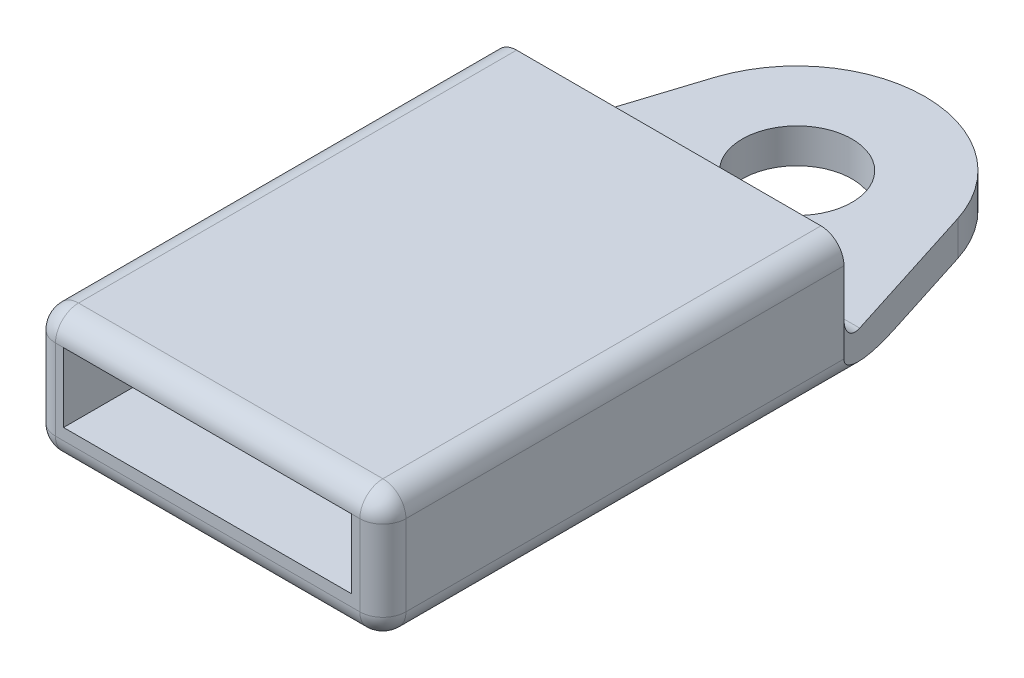
ISO-10303-21;
HEADER;
FILE_DESCRIPTION(('STEP AP214'),'2;1');
FILE_NAME('part.step','',(''),(''),'','','');
FILE_SCHEMA(('AUTOMOTIVE_DESIGN { 1 0 10303 214 1 1 1 1 }'));
ENDSEC;
DATA;
#1=APPLICATION_CONTEXT('core data for automotive mechanical design processes');
#2=APPLICATION_PROTOCOL_DEFINITION('international standard','automotive_design',2000,#1);
#3=PRODUCT_CONTEXT('',#1,'mechanical');
#4=PRODUCT('Part','Part','',(#3));
#5=PRODUCT_RELATED_PRODUCT_CATEGORY('part','',(#4));
#6=PRODUCT_DEFINITION_FORMATION('','',#4);
#7=PRODUCT_DEFINITION_CONTEXT('part definition',#1,'design');
#8=PRODUCT_DEFINITION('design','',#6,#7);
#9=PRODUCT_DEFINITION_SHAPE('','',#8);
#10=(LENGTH_UNIT() NAMED_UNIT(*) SI_UNIT(.MILLI.,.METRE.));
#11=(NAMED_UNIT(*) PLANE_ANGLE_UNIT() SI_UNIT($,.RADIAN.));
#12=(NAMED_UNIT(*) SI_UNIT($,.STERADIAN.) SOLID_ANGLE_UNIT());
#13=UNCERTAINTY_MEASURE_WITH_UNIT(LENGTH_MEASURE(1.E-05),#10,'distance_accuracy_value','');
#14=(GEOMETRIC_REPRESENTATION_CONTEXT(3) GLOBAL_UNCERTAINTY_ASSIGNED_CONTEXT((#13)) GLOBAL_UNIT_ASSIGNED_CONTEXT((#10,
#11,#12)) REPRESENTATION_CONTEXT('',''));
#15=CARTESIAN_POINT('',(0.,0.,0.));
#16=DIRECTION('',(0.,0.,1.));
#17=DIRECTION('',(1.,0.,0.));
#18=AXIS2_PLACEMENT_3D('',#15,#16,#17);
#19=CARTESIAN_POINT('',(0.,11.,-40.));
#20=DIRECTION('',(0.,0.,1.));
#21=DIRECTION('',(1.,0.,0.));
#22=AXIS2_PLACEMENT_3D('',#19,#20,#21);
#23=PLANE('',#22);
#24=DIRECTION('',(0.,-1.,0.));
#25=VECTOR('',#24,1.);
#26=CARTESIAN_POINT('',(0.,11.,-40.));
#27=LINE('',#26,#25);
#28=CARTESIAN_POINT('',(0.,9.,-40.));
#29=VERTEX_POINT('',#28);
#30=CARTESIAN_POINT('',(0.,5.,-40.));
#31=VERTEX_POINT('',#30);
#32=EDGE_CURVE('E308',#29,#31,#27,.T.);
#33=ORIENTED_EDGE('',*,*,#32,.T.);
#34=DIRECTION('',(1.,0.,0.));
#35=VECTOR('',#34,1.);
#36=CARTESIAN_POINT('',(0.,5.,-40.));
#37=LINE('',#36,#35);
#38=CARTESIAN_POINT('',(-2.7,5.,-40.));
#39=VERTEX_POINT('',#38);
#40=EDGE_CURVE('E256',#31,#39,#37,.F.);
#41=ORIENTED_EDGE('',*,*,#40,.T.);
#42=DIRECTION('',(0.,-1.,0.));
#43=VECTOR('',#42,1.);
#44=CARTESIAN_POINT('',(-2.7,11.,-40.));
#45=LINE('',#44,#43);
#46=CARTESIAN_POINT('',(-2.70000000000437,9.00000000000001,-40.));
#47=VERTEX_POINT('',#46);
#48=EDGE_CURVE('E282',#47,#39,#45,.T.);
#49=ORIENTED_EDGE('',*,*,#48,.F.);
#50=DIRECTION('',(-1.,0.,0.));
#51=VECTOR('',#50,1.);
#52=CARTESIAN_POINT('',(500000.,9.00000000000001,-40.0000000001301));
#53=LINE('',#52,#51);
#54=CARTESIAN_POINT('',(-27.7,9.00000000000001,-40.));
#55=VERTEX_POINT('',#54);
#56=EDGE_CURVE('E276',#47,#55,#53,.T.);
#57=ORIENTED_EDGE('',*,*,#56,.T.);
#58=DIRECTION('',(0.,-1.,0.));
#59=VECTOR('',#58,1.);
#60=CARTESIAN_POINT('',(-27.7,11.,-40.));
#61=LINE('',#60,#59);
#62=CARTESIAN_POINT('',(-27.7,5.,-40.));
#63=VERTEX_POINT('',#62);
#64=EDGE_CURVE('E234',#55,#63,#61,.T.);
#65=ORIENTED_EDGE('',*,*,#64,.T.);
#66=DIRECTION('',(1.,0.,0.));
#67=VECTOR('',#66,1.);
#68=CARTESIAN_POINT('',(0.,5.,-40.));
#69=LINE('',#68,#67);
#70=CARTESIAN_POINT('',(-30.4,5.,-40.));
#71=VERTEX_POINT('',#70);
#72=EDGE_CURVE('E253',#63,#71,#69,.F.);
#73=ORIENTED_EDGE('',*,*,#72,.T.);
#74=DIRECTION('',(0.,-1.,0.));
#75=VECTOR('',#74,1.);
#76=CARTESIAN_POINT('',(-30.4,11.,-40.));
#77=LINE('',#76,#75);
#78=CARTESIAN_POINT('',(-30.4,9.,-40.));
#79=VERTEX_POINT('',#78);
#80=EDGE_CURVE('E278',#79,#71,#77,.T.);
#81=ORIENTED_EDGE('',*,*,#80,.F.);
#82=CARTESIAN_POINT('',(-28.4,9.,-40.));
#83=DIRECTION('',(0.,0.,1.));
#84=DIRECTION('',(1.,0.,0.));
#85=AXIS2_PLACEMENT_3D('',#82,#83,#84);
#86=CIRCLE('',#85,2.);
#87=CARTESIAN_POINT('',(-28.4,11.,-40.));
#88=VERTEX_POINT('',#87);
#89=EDGE_CURVE('E343',#79,#88,#86,.F.);
#90=ORIENTED_EDGE('',*,*,#89,.T.);
#91=DIRECTION('',(-1.,0.,0.));
#92=VECTOR('',#91,1.);
#93=CARTESIAN_POINT('',(0.,11.,-40.));
#94=LINE('',#93,#92);
#95=CARTESIAN_POINT('',(-2.,11.,-40.));
#96=VERTEX_POINT('',#95);
#97=EDGE_CURVE('E301',#96,#88,#94,.T.);
#98=ORIENTED_EDGE('',*,*,#97,.F.);
#99=CARTESIAN_POINT('',(-2.,9.,-40.));
#100=DIRECTION('',(0.,0.,1.));
#101=DIRECTION('',(1.,0.,0.));
#102=AXIS2_PLACEMENT_3D('',#99,#100,#101);
#103=CIRCLE('',#102,2.);
#104=EDGE_CURVE('E344',#96,#29,#103,.F.);
#105=ORIENTED_EDGE('',*,*,#104,.T.);
#106=EDGE_LOOP('',(#33,#41,#49,#57,#65,#73,#81,#90,#98,#105));
#107=FACE_BOUND('',#106,.T.);
#108=ADVANCED_FACE('F34',(#107),#23,.F.);
#109=CARTESIAN_POINT('',(-27.7,11.,0.));
#110=DIRECTION('',(1.,0.,0.));
#111=DIRECTION('',(0.,0.,-1.));
#112=AXIS2_PLACEMENT_3D('',#109,#110,#111);
#113=PLANE('',#112);
#114=ORIENTED_EDGE('',*,*,#64,.F.);
#115=DIRECTION('',(0.,0.,-1.));
#116=VECTOR('',#115,1.);
#117=CARTESIAN_POINT('',(-27.7,9.00000000000001,-40.));
#118=LINE('',#117,#116);
#119=CARTESIAN_POINT('',(-27.7,9.,0.));
#120=VERTEX_POINT('',#119);
#121=EDGE_CURVE('E318',#120,#55,#118,.T.);
#122=ORIENTED_EDGE('',*,*,#121,.F.);
#123=DIRECTION('',(0.,-1.,0.));
#124=VECTOR('',#123,1.);
#125=CARTESIAN_POINT('',(-27.7,11.,0.));
#126=LINE('',#125,#124);
#127=CARTESIAN_POINT('',(-27.7,3.,0.));
#128=VERTEX_POINT('',#127);
#129=EDGE_CURVE('E304',#120,#128,#126,.T.);
#130=ORIENTED_EDGE('',*,*,#129,.T.);
#131=DIRECTION('',(0.,0.,1.));
#132=VECTOR('',#131,1.);
#133=CARTESIAN_POINT('',(-27.7,3.,-40.));
#134=LINE('',#133,#132);
#135=CARTESIAN_POINT('',(-27.7,3.,-42.));
#136=VERTEX_POINT('',#135);
#137=EDGE_CURVE('E269',#136,#128,#134,.T.);
#138=ORIENTED_EDGE('',*,*,#137,.F.);
#139=CARTESIAN_POINT('',(-27.7,5.,-42.));
#140=DIRECTION('',(1.,0.,0.));
#141=DIRECTION('',(0.,0.,-1.));
#142=AXIS2_PLACEMENT_3D('',#139,#140,#141);
#143=CIRCLE('',#142,2.);
#144=EDGE_CURVE('E43',#136,#63,#143,.F.);
#145=ORIENTED_EDGE('',*,*,#144,.T.);
#146=EDGE_LOOP('',(#114,#122,#130,#138,#145));
#147=FACE_BOUND('',#146,.T.);
#148=ADVANCED_FACE('F266',(#147),#113,.T.);
#149=CARTESIAN_POINT('',(-2.7,11.,0.));
#150=DIRECTION('',(1.,0.,0.));
#151=DIRECTION('',(0.,0.,-1.));
#152=AXIS2_PLACEMENT_3D('',#149,#150,#151);
#153=PLANE('',#152);
#154=DIRECTION('',(0.,0.,-1.));
#155=VECTOR('',#154,1.);
#156=CARTESIAN_POINT('',(-2.70000000000437,9.00000000000001,-40.0000000000976));
#157=LINE('',#156,#155);
#158=CARTESIAN_POINT('',(-2.70000000000437,9.,0.));
#159=VERTEX_POINT('',#158);
#160=EDGE_CURVE('E313',#159,#47,#157,.T.);
#161=ORIENTED_EDGE('',*,*,#160,.T.);
#162=ORIENTED_EDGE('',*,*,#48,.T.);
#163=CARTESIAN_POINT('',(-2.7,5.,-42.));
#164=DIRECTION('',(1.,0.,0.));
#165=DIRECTION('',(0.,0.,-1.));
#166=AXIS2_PLACEMENT_3D('',#163,#164,#165);
#167=CIRCLE('',#166,2.);
#168=CARTESIAN_POINT('',(-2.7,3.,-42.));
#169=VERTEX_POINT('',#168);
#170=EDGE_CURVE('E261',#39,#169,#167,.T.);
#171=ORIENTED_EDGE('',*,*,#170,.T.);
#172=DIRECTION('',(0.,0.,-1.));
#173=VECTOR('',#172,1.);
#174=CARTESIAN_POINT('',(-2.7,3.,-40.));
#175=LINE('',#174,#173);
#176=CARTESIAN_POINT('',(-2.7,3.,0.));
#177=VERTEX_POINT('',#176);
#178=EDGE_CURVE('E284',#177,#169,#175,.T.);
#179=ORIENTED_EDGE('',*,*,#178,.F.);
#180=DIRECTION('',(0.,-1.,0.));
#181=VECTOR('',#180,1.);
#182=CARTESIAN_POINT('',(-2.7,11.,0.));
#183=LINE('',#182,#181);
#184=EDGE_CURVE('E287',#159,#177,#183,.T.);
#185=ORIENTED_EDGE('',*,*,#184,.F.);
#186=EDGE_LOOP('',(#161,#162,#171,#179,#185));
#187=FACE_BOUND('',#186,.T.);
#188=ADVANCED_FACE('F409',(#187),#153,.F.);
#189=CARTESIAN_POINT('',(-30.4,11.,0.));
#190=DIRECTION('',(-1.,0.,0.));
#191=DIRECTION('',(0.,0.,1.));
#192=AXIS2_PLACEMENT_3D('',#189,#190,#191);
#193=PLANE('',#192);
#194=DIRECTION('',(0.,-1.,0.));
#195=VECTOR('',#194,1.);
#196=CARTESIAN_POINT('',(-30.4,100.652782585308,-40.));
#197=LINE('',#196,#195);
#198=CARTESIAN_POINT('',(-30.4,2.,-40.));
#199=VERTEX_POINT('',#198);
#200=EDGE_CURVE('E181',#71,#199,#197,.T.);
#201=ORIENTED_EDGE('',*,*,#200,.T.);
#202=DIRECTION('',(0.,0.,-1.));
#203=VECTOR('',#202,1.);
#204=CARTESIAN_POINT('',(-30.4,2.,-2.));
#205=LINE('',#204,#203);
#206=CARTESIAN_POINT('',(-30.4,2.,-2.));
#207=VERTEX_POINT('',#206);
#208=EDGE_CURVE('E251',#199,#207,#205,.F.);
#209=ORIENTED_EDGE('',*,*,#208,.T.);
#210=DIRECTION('',(0.,-1.,0.));
#211=VECTOR('',#210,1.);
#212=CARTESIAN_POINT('',(-30.4,11.,-2.));
#213=LINE('',#212,#211);
#214=CARTESIAN_POINT('',(-30.4,9.,-2.));
#215=VERTEX_POINT('',#214);
#216=EDGE_CURVE('E337',#207,#215,#213,.F.);
#217=ORIENTED_EDGE('',*,*,#216,.T.);
#218=DIRECTION('',(0.,0.,-1.));
#219=VECTOR('',#218,1.);
#220=CARTESIAN_POINT('',(-30.4,9.,0.));
#221=LINE('',#220,#219);
#222=EDGE_CURVE('E334',#215,#79,#221,.T.);
#223=ORIENTED_EDGE('',*,*,#222,.T.);
#224=ORIENTED_EDGE('',*,*,#80,.T.);
#225=EDGE_LOOP('',(#201,#209,#217,#223,#224));
#226=FACE_BOUND('',#225,.T.);
#227=ADVANCED_FACE('F458',(#226),#193,.T.);
#228=CARTESIAN_POINT('',(0.,11.,0.));
#229=DIRECTION('',(0.,0.,1.));
#230=DIRECTION('',(1.,0.,0.));
#231=AXIS2_PLACEMENT_3D('',#228,#229,#230);
#232=PLANE('',#231);
#233=DIRECTION('',(0.,-1.,0.));
#234=VECTOR('',#233,1.);
#235=CARTESIAN_POINT('',(-28.4,11.,0.));
#236=LINE('',#235,#234);
#237=CARTESIAN_POINT('',(-28.4,9.,0.));
#238=VERTEX_POINT('',#237);
#239=CARTESIAN_POINT('',(-28.4,2.,0.));
#240=VERTEX_POINT('',#239);
#241=EDGE_CURVE('E325',#238,#240,#236,.T.);
#242=ORIENTED_EDGE('',*,*,#241,.T.);
#243=DIRECTION('',(-1.,0.,0.));
#244=VECTOR('',#243,1.);
#245=CARTESIAN_POINT('',(-2.,2.,0.));
#246=LINE('',#245,#244);
#247=CARTESIAN_POINT('',(-2.,2.,0.));
#248=VERTEX_POINT('',#247);
#249=EDGE_CURVE('E360',#240,#248,#246,.F.);
#250=ORIENTED_EDGE('',*,*,#249,.T.);
#251=DIRECTION('',(0.,-1.,0.));
#252=VECTOR('',#251,1.);
#253=CARTESIAN_POINT('',(-2.,9.,0.));
#254=LINE('',#253,#252);
#255=CARTESIAN_POINT('',(-2.,9.,0.));
#256=VERTEX_POINT('',#255);
#257=EDGE_CURVE('E328',#248,#256,#254,.F.);
#258=ORIENTED_EDGE('',*,*,#257,.T.);
#259=DIRECTION('',(-1.,0.,0.));
#260=VECTOR('',#259,1.);
#261=CARTESIAN_POINT('',(0.,9.,0.));
#262=LINE('',#261,#260);
#263=EDGE_CURVE('E408',#256,#159,#262,.T.);
#264=ORIENTED_EDGE('',*,*,#263,.T.);
#265=ORIENTED_EDGE('',*,*,#184,.T.);
#266=DIRECTION('',(1.,0.,0.));
#267=VECTOR('',#266,1.);
#268=CARTESIAN_POINT('',(-27.7,3.,0.));
#269=LINE('',#268,#267);
#270=EDGE_CURVE('E281',#128,#177,#269,.T.);
#271=ORIENTED_EDGE('',*,*,#270,.F.);
#272=ORIENTED_EDGE('',*,*,#129,.F.);
#273=DIRECTION('',(-1.,0.,0.));
#274=VECTOR('',#273,1.);
#275=CARTESIAN_POINT('',(0.,9.,0.));
#276=LINE('',#275,#274);
#277=EDGE_CURVE('E172',#120,#238,#276,.T.);
#278=ORIENTED_EDGE('',*,*,#277,.T.);
#279=EDGE_LOOP('',(#242,#250,#258,#264,#265,#271,#272,#278));
#280=FACE_BOUND('',#279,.T.);
#281=ADVANCED_FACE('F404',(#280),#232,.T.);
#282=CARTESIAN_POINT('',(0.,11.,0.));
#283=DIRECTION('',(0.,1.,0.));
#284=DIRECTION('',(0.,0.,1.));
#285=AXIS2_PLACEMENT_3D('',#282,#283,#284);
#286=PLANE('',#285);
#287=DIRECTION('',(-1.,0.,0.));
#288=VECTOR('',#287,1.);
#289=CARTESIAN_POINT('',(0.,11.,-2.));
#290=LINE('',#289,#288);
#291=CARTESIAN_POINT('',(-28.4,11.,-2.));
#292=VERTEX_POINT('',#291);
#293=CARTESIAN_POINT('',(-2.,11.,-2.));
#294=VERTEX_POINT('',#293);
#295=EDGE_CURVE('E319',#292,#294,#290,.F.);
#296=ORIENTED_EDGE('',*,*,#295,.T.);
#297=DIRECTION('',(0.,0.,-1.));
#298=VECTOR('',#297,1.);
#299=CARTESIAN_POINT('',(-2.,11.,-40.));
#300=LINE('',#299,#298);
#301=EDGE_CURVE('E341',#294,#96,#300,.T.);
#302=ORIENTED_EDGE('',*,*,#301,.T.);
#303=ORIENTED_EDGE('',*,*,#97,.T.);
#304=DIRECTION('',(0.,0.,-1.));
#305=VECTOR('',#304,1.);
#306=CARTESIAN_POINT('',(-28.4,11.,0.));
#307=LINE('',#306,#305);
#308=EDGE_CURVE('E339',#88,#292,#307,.F.);
#309=ORIENTED_EDGE('',*,*,#308,.T.);
#310=EDGE_LOOP('',(#296,#302,#303,#309));
#311=FACE_BOUND('',#310,.T.);
#312=ADVANCED_FACE('F437',(#311),#286,.T.);
#313=CARTESIAN_POINT('',(0.,0.,0.));
#314=DIRECTION('',(0.,1.,0.));
#315=DIRECTION('',(0.,0.,1.));
#316=AXIS2_PLACEMENT_3D('',#313,#314,#315);
#317=PLANE('',#316);
#318=CARTESIAN_POINT('',(-15.1767063042534,0.,-51.1124511722232));
#319=DIRECTION('',(0.,1.,0.));
#320=DIRECTION('',(0.,0.,1.));
#321=AXIS2_PLACEMENT_3D('',#318,#319,#320);
#322=CIRCLE('',#321,4.7625);
#323=CARTESIAN_POINT('',(-15.1767063042534,0.,-46.3499511722232));
#324=VERTEX_POINT('',#323);
#325=EDGE_CURVE('E206',#324,#324,#322,.T.);
#326=ORIENTED_EDGE('',*,*,#325,.T.);
#327=EDGE_LOOP('',(#326));
#328=FACE_BOUND('',#327,.T.);
#329=DIRECTION('',(0.303367993593857,0.,0.952873475579438));
#330=VECTOR('',#329,1.);
#331=CARTESIAN_POINT('',(11.5628525774136,0.,-3.68128558148649));
#332=LINE('',#331,#330);
#333=CARTESIAN_POINT('',(-4.61119350262757,0.,-54.4836768288104));
#334=VERTEX_POINT('',#333);
#335=CARTESIAN_POINT('',(-2.,0.,-46.2819644504432));
#336=VERTEX_POINT('',#335);
#337=EDGE_CURVE('E196',#334,#336,#332,.T.);
#338=ORIENTED_EDGE('',*,*,#337,.T.);
#339=DIRECTION('',(0.,0.,-1.));
#340=VECTOR('',#339,1.);
#341=CARTESIAN_POINT('',(-2.,0.,0.));
#342=LINE('',#341,#340);
#343=CARTESIAN_POINT('',(-2.,0.,-2.));
#344=VERTEX_POINT('',#343);
#345=EDGE_CURVE('E356',#336,#344,#342,.F.);
#346=ORIENTED_EDGE('',*,*,#345,.T.);
#347=DIRECTION('',(-1.,0.,0.));
#348=VECTOR('',#347,1.);
#349=CARTESIAN_POINT('',(-28.4,0.,-2.));
#350=LINE('',#349,#348);
#351=CARTESIAN_POINT('',(-28.4,0.,-2.));
#352=VERTEX_POINT('',#351);
#353=EDGE_CURVE('E352',#344,#352,#350,.T.);
#354=ORIENTED_EDGE('',*,*,#353,.T.);
#355=DIRECTION('',(0.,0.,-1.));
#356=VECTOR('',#355,1.);
#357=CARTESIAN_POINT('',(-28.4,0.,-40.));
#358=LINE('',#357,#356);
#359=CARTESIAN_POINT('',(-28.4,0.,-46.2814094248398));
#360=VERTEX_POINT('',#359);
#361=EDGE_CURVE('E349',#352,#360,#358,.T.);
#362=ORIENTED_EDGE('',*,*,#361,.T.);
#363=DIRECTION('',(0.303392331928232,0.,-0.952865726599058));
#364=VECTOR('',#363,1.);
#365=CARTESIAN_POINT('',(-39.1654602172804,0.,-12.4702777890583));
#366=LINE('',#365,#364);
#367=CARTESIAN_POINT('',(-25.7601682869102,0.,-54.5723413261363));
#368=VERTEX_POINT('',#367);
#369=EDGE_CURVE('E200',#360,#368,#366,.T.);
#370=ORIENTED_EDGE('',*,*,#369,.T.);
#371=CARTESIAN_POINT('',(-15.2,0.,-51.1125));
#372=DIRECTION('',(0.,1.,0.));
#373=DIRECTION('',(0.,0.,1.));
#374=AXIS2_PLACEMENT_3D('',#371,#372,#373);
#375=CIRCLE('',#374,11.1124999999957);
#376=EDGE_CURVE('E180',#368,#334,#375,.F.);
#377=ORIENTED_EDGE('',*,*,#376,.T.);
#378=EDGE_LOOP('',(#338,#346,#354,#362,#370,#377));
#379=FACE_BOUND('',#378,.T.);
#380=ADVANCED_FACE('F389',(#328,#379),#317,.F.);
#381=CARTESIAN_POINT('',(0.,3.,0.));
#382=DIRECTION('',(0.,1.,0.));
#383=DIRECTION('',(0.,0.,1.));
#384=AXIS2_PLACEMENT_3D('',#381,#382,#383);
#385=PLANE('',#384);
#386=CARTESIAN_POINT('',(-15.1767063042534,3.,-51.1124511722232));
#387=DIRECTION('',(0.,1.,0.));
#388=DIRECTION('',(0.,0.,1.));
#389=AXIS2_PLACEMENT_3D('',#386,#387,#388);
#390=CIRCLE('',#389,4.7625);
#391=CARTESIAN_POINT('',(-15.1767063042534,3.,-46.3499511722232));
#392=VERTEX_POINT('',#391);
#393=EDGE_CURVE('E209',#392,#392,#390,.T.);
#394=ORIENTED_EDGE('',*,*,#393,.F.);
#395=EDGE_LOOP('',(#394));
#396=FACE_BOUND('',#395,.T.);
#397=ORIENTED_EDGE('',*,*,#178,.T.);
#398=DIRECTION('',(1.,0.,0.));
#399=VECTOR('',#398,1.);
#400=CARTESIAN_POINT('',(0.,3.,-42.));
#401=LINE('',#400,#399);
#402=CARTESIAN_POINT('',(-0.636743495057157,3.,-42.));
#403=VERTEX_POINT('',#402);
#404=EDGE_CURVE('E250',#169,#403,#401,.T.);
#405=ORIENTED_EDGE('',*,*,#404,.T.);
#406=DIRECTION('',(0.303367993593857,0.,0.952873475579438));
#407=VECTOR('',#406,1.);
#408=CARTESIAN_POINT('',(11.5628525774136,3.,-3.68128558148649));
#409=LINE('',#408,#407);
#410=CARTESIAN_POINT('',(-4.61119350262757,3.,-54.4836768288104));
#411=VERTEX_POINT('',#410);
#412=EDGE_CURVE('E188',#411,#403,#409,.T.);
#413=ORIENTED_EDGE('',*,*,#412,.F.);
#414=CARTESIAN_POINT('',(-15.2,3.,-51.1125));
#415=DIRECTION('',(0.,1.,0.));
#416=DIRECTION('',(0.,0.,1.));
#417=AXIS2_PLACEMENT_3D('',#414,#415,#416);
#418=CIRCLE('',#417,11.1124999999957);
#419=CARTESIAN_POINT('',(-25.7601682869102,3.,-54.5723413261363));
#420=VERTEX_POINT('',#419);
#421=EDGE_CURVE('E178',#420,#411,#418,.F.);
#422=ORIENTED_EDGE('',*,*,#421,.F.);
#423=DIRECTION('',(0.303392331928232,0.,-0.952865726599058));
#424=VECTOR('',#423,1.);
#425=CARTESIAN_POINT('',(-39.1654602172804,3.,-12.4702777890583));
#426=LINE('',#425,#424);
#427=CARTESIAN_POINT('',(-29.7632002422606,3.,-42.));
#428=VERTEX_POINT('',#427);
#429=EDGE_CURVE('E162',#428,#420,#426,.T.);
#430=ORIENTED_EDGE('',*,*,#429,.F.);
#431=DIRECTION('',(1.,0.,0.));
#432=VECTOR('',#431,1.);
#433=CARTESIAN_POINT('',(0.,3.,-42.));
#434=LINE('',#433,#432);
#435=EDGE_CURVE('E248',#428,#136,#434,.T.);
#436=ORIENTED_EDGE('',*,*,#435,.T.);
#437=ORIENTED_EDGE('',*,*,#137,.T.);
#438=ORIENTED_EDGE('',*,*,#270,.T.);
#439=EDGE_LOOP('',(#397,#405,#413,#422,#430,#436,#437,#438));
#440=FACE_BOUND('',#439,.T.);
#441=ADVANCED_FACE('F185',(#396,#440),#385,.T.);
#442=CARTESIAN_POINT('',(0.,11.,0.));
#443=DIRECTION('',(-1.,0.,0.));
#444=DIRECTION('',(0.,0.,1.));
#445=AXIS2_PLACEMENT_3D('',#442,#443,#444);
#446=PLANE('',#445);
#447=DIRECTION('',(0.,-1.,0.));
#448=VECTOR('',#447,1.);
#449=CARTESIAN_POINT('',(0.,0.,-2.));
#450=LINE('',#449,#448);
#451=CARTESIAN_POINT('',(0.,9.,-2.));
#452=VERTEX_POINT('',#451);
#453=CARTESIAN_POINT('',(0.,2.,-2.));
#454=VERTEX_POINT('',#453);
#455=EDGE_CURVE('E322',#452,#454,#450,.T.);
#456=ORIENTED_EDGE('',*,*,#455,.T.);
#457=DIRECTION('',(0.,0.,-1.));
#458=VECTOR('',#457,1.);
#459=CARTESIAN_POINT('',(0.,2.,0.));
#460=LINE('',#459,#458);
#461=CARTESIAN_POINT('',(0.,2.,-40.));
#462=VERTEX_POINT('',#461);
#463=EDGE_CURVE('E235',#454,#462,#460,.T.);
#464=ORIENTED_EDGE('',*,*,#463,.T.);
#465=DIRECTION('',(0.,1.,0.));
#466=VECTOR('',#465,1.);
#467=CARTESIAN_POINT('',(0.,11.,-40.));
#468=LINE('',#467,#466);
#469=EDGE_CURVE('E49',#462,#31,#468,.T.);
#470=ORIENTED_EDGE('',*,*,#469,.T.);
#471=ORIENTED_EDGE('',*,*,#32,.F.);
#472=DIRECTION('',(0.,0.,-1.));
#473=VECTOR('',#472,1.);
#474=CARTESIAN_POINT('',(0.,9.,-2.));
#475=LINE('',#474,#473);
#476=EDGE_CURVE('E320',#29,#452,#475,.F.);
#477=ORIENTED_EDGE('',*,*,#476,.T.);
#478=EDGE_LOOP('',(#456,#464,#470,#471,#477));
#479=FACE_BOUND('',#478,.T.);
#480=ADVANCED_FACE('F442',(#479),#446,.F.);
#481=CARTESIAN_POINT('',(500000.,9.00000000000001,-40.0000000001301));
#482=DIRECTION('',(0.,1.,0.));
#483=DIRECTION('',(0.,0.,1.));
#484=AXIS2_PLACEMENT_3D('',#481,#482,#483);
#485=PLANE('',#484);
#486=ORIENTED_EDGE('',*,*,#160,.F.);
#487=DIRECTION('',(-1.,0.,0.));
#488=VECTOR('',#487,1.);
#489=CARTESIAN_POINT('',(500000.,9.,-1.30104260698261E-10));
#490=LINE('',#489,#488);
#491=EDGE_CURVE('E391',#159,#120,#490,.T.);
#492=ORIENTED_EDGE('',*,*,#491,.T.);
#493=ORIENTED_EDGE('',*,*,#121,.T.);
#494=ORIENTED_EDGE('',*,*,#56,.F.);
#495=EDGE_LOOP('',(#486,#492,#493,#494));
#496=FACE_BOUND('',#495,.T.);
#497=ADVANCED_FACE('F400',(#496),#485,.F.);
#498=CARTESIAN_POINT('',(-25.7601682869102,100.652782585308,-54.5723413261363));
#499=DIRECTION('',(0.952865726599057,0.,0.303392331928232));
#500=DIRECTION('',(0.303392331928232,0.,-0.952865726599058));
#501=AXIS2_PLACEMENT_3D('',#498,#499,#500);
#502=PLANE('',#501);
#503=ORIENTED_EDGE('',*,*,#369,.F.);
#504=CARTESIAN_POINT('',(-28.4,2.,-46.2814094248398));
#505=DIRECTION('',(0.952865726599057,0.,0.303392331928232));
#506=DIRECTION('',(-0.303392331928232,0.,0.952865726599057));
#507=AXIS2_PLACEMENT_3D('',#504,#505,#506);
#508=ELLIPSE('',#507,6.59212441952259,2.);
#509=EDGE_CURVE('E364',#360,#199,#508,.F.);
#510=ORIENTED_EDGE('',*,*,#509,.T.);
#511=ORIENTED_EDGE('',*,*,#200,.F.);
#512=CARTESIAN_POINT('',(-29.7632002422606,5.,-42.));
#513=DIRECTION('',(0.952865726599057,0.,0.303392331928232));
#514=DIRECTION('',(0.303392331928232,0.,-0.952865726599058));
#515=AXIS2_PLACEMENT_3D('',#512,#513,#514);
#516=ELLIPSE('',#515,2.09893161667001,2.);
#517=EDGE_CURVE('E11',#71,#428,#516,.T.);
#518=ORIENTED_EDGE('',*,*,#517,.T.);
#519=ORIENTED_EDGE('',*,*,#429,.T.);
#520=DIRECTION('',(0.,-1.,0.));
#521=VECTOR('',#520,1.);
#522=CARTESIAN_POINT('',(-25.7601682869102,100.652782585308,-54.5723413261363));
#523=LINE('',#522,#521);
#524=EDGE_CURVE('E166',#420,#368,#523,.T.);
#525=ORIENTED_EDGE('',*,*,#524,.T.);
#526=EDGE_LOOP('',(#503,#510,#511,#518,#519,#525));
#527=FACE_BOUND('',#526,.T.);
#528=ADVANCED_FACE('F165',(#527),#502,.F.);
#529=CARTESIAN_POINT('',(0.,100.652782585308,-40.));
#530=DIRECTION('',(-0.952873475579438,0.,0.303367993593857));
#531=DIRECTION('',(0.303367993593857,0.,0.952873475579438));
#532=AXIS2_PLACEMENT_3D('',#529,#530,#531);
#533=PLANE('',#532);
#534=ORIENTED_EDGE('',*,*,#469,.F.);
#535=CARTESIAN_POINT('',(-2.,2.,-46.2819644504432));
#536=DIRECTION('',(-0.952873475579438,0.,0.303367993593857));
#537=DIRECTION('',(-0.303367993593857,0.,-0.952873475579438));
#538=AXIS2_PLACEMENT_3D('',#535,#536,#537);
#539=ELLIPSE('',#538,6.59265328654796,2.);
#540=EDGE_CURVE('E347',#462,#336,#539,.F.);
#541=ORIENTED_EDGE('',*,*,#540,.T.);
#542=ORIENTED_EDGE('',*,*,#337,.F.);
#543=DIRECTION('',(0.,-1.,0.));
#544=VECTOR('',#543,1.);
#545=CARTESIAN_POINT('',(-4.61119350262757,100.652782585308,-54.4836768288104));
#546=LINE('',#545,#544);
#547=EDGE_CURVE('E182',#411,#334,#546,.T.);
#548=ORIENTED_EDGE('',*,*,#547,.F.);
#549=ORIENTED_EDGE('',*,*,#412,.T.);
#550=CARTESIAN_POINT('',(-0.636743495057159,5.,-42.));
#551=DIRECTION('',(-0.952873475579438,0.,0.303367993593857));
#552=DIRECTION('',(0.303367993593857,0.,0.952873475579438));
#553=AXIS2_PLACEMENT_3D('',#550,#551,#552);
#554=ELLIPSE('',#553,2.09891454768831,2.);
#555=EDGE_CURVE('E258',#403,#31,#554,.T.);
#556=ORIENTED_EDGE('',*,*,#555,.T.);
#557=EDGE_LOOP('',(#534,#541,#542,#548,#549,#556));
#558=FACE_BOUND('',#557,.T.);
#559=ADVANCED_FACE('F413',(#558),#533,.F.);
#560=CARTESIAN_POINT('',(-15.2,100.652782585308,-51.1125));
#561=DIRECTION('',(0.,-1.,0.));
#562=DIRECTION('',(0.,0.,-1.));
#563=AXIS2_PLACEMENT_3D('',#560,#561,#562);
#564=CYLINDRICAL_SURFACE('',#563,11.1124999999957);
#565=ORIENTED_EDGE('',*,*,#376,.F.);
#566=ORIENTED_EDGE('',*,*,#524,.F.);
#567=ORIENTED_EDGE('',*,*,#421,.T.);
#568=ORIENTED_EDGE('',*,*,#547,.T.);
#569=EDGE_LOOP('',(#565,#566,#567,#568));
#570=FACE_BOUND('',#569,.T.);
#571=ADVANCED_FACE('F176',(#570),#564,.T.);
#572=CARTESIAN_POINT('',(-15.1767063042534,-2.5000000003321E-05,-51.1124511722232));
#573=DIRECTION('',(0.,1.,0.));
#574=DIRECTION('',(0.,0.,1.));
#575=AXIS2_PLACEMENT_3D('',#572,#573,#574);
#576=CYLINDRICAL_SURFACE('',#575,4.7625);
#577=ORIENTED_EDGE('',*,*,#393,.T.);
#578=EDGE_LOOP('',(#577));
#579=FACE_BOUND('',#578,.T.);
#580=ORIENTED_EDGE('',*,*,#325,.F.);
#581=EDGE_LOOP('',(#580));
#582=FACE_BOUND('',#581,.T.);
#583=ADVANCED_FACE('F463',(#579,#582),#576,.F.);
#584=CARTESIAN_POINT('',(0.,9.,-2.));
#585=DIRECTION('',(-1.,0.,0.));
#586=DIRECTION('',(0.,0.,1.));
#587=AXIS2_PLACEMENT_3D('',#584,#585,#586);
#588=CYLINDRICAL_SURFACE('',#587,2.);
#589=ORIENTED_EDGE('',*,*,#263,.F.);
#590=CARTESIAN_POINT('',(-2.,9.,-2.));
#591=DIRECTION('',(-1.,0.,0.));
#592=DIRECTION('',(0.,0.,1.));
#593=AXIS2_PLACEMENT_3D('',#590,#591,#592);
#594=CIRCLE('',#593,2.);
#595=EDGE_CURVE('E332',#256,#294,#594,.T.);
#596=ORIENTED_EDGE('',*,*,#595,.T.);
#597=ORIENTED_EDGE('',*,*,#295,.F.);
#598=CARTESIAN_POINT('',(-28.4,9.,-2.));
#599=DIRECTION('',(-1.,0.,0.));
#600=DIRECTION('',(0.,0.,1.));
#601=AXIS2_PLACEMENT_3D('',#598,#599,#600);
#602=CIRCLE('',#601,2.);
#603=EDGE_CURVE('E330',#292,#238,#602,.F.);
#604=ORIENTED_EDGE('',*,*,#603,.T.);
#605=ORIENTED_EDGE('',*,*,#277,.F.);
#606=ORIENTED_EDGE('',*,*,#491,.F.);
#607=EDGE_LOOP('',(#589,#596,#597,#604,#605,#606));
#608=FACE_BOUND('',#607,.T.);
#609=ADVANCED_FACE('F433',(#608),#588,.T.);
#610=CARTESIAN_POINT('',(-2.,9.,0.));
#611=DIRECTION('',(0.,0.,1.));
#612=DIRECTION('',(1.,0.,0.));
#613=AXIS2_PLACEMENT_3D('',#610,#611,#612);
#614=CYLINDRICAL_SURFACE('',#613,2.);
#615=ORIENTED_EDGE('',*,*,#104,.F.);
#616=ORIENTED_EDGE('',*,*,#301,.F.);
#617=CARTESIAN_POINT('',(-2.,9.,-2.));
#618=DIRECTION('',(0.,0.,1.));
#619=DIRECTION('',(1.,0.,0.));
#620=AXIS2_PLACEMENT_3D('',#617,#618,#619);
#621=CIRCLE('',#620,2.);
#622=EDGE_CURVE('E211',#452,#294,#621,.T.);
#623=ORIENTED_EDGE('',*,*,#622,.F.);
#624=ORIENTED_EDGE('',*,*,#476,.F.);
#625=EDGE_LOOP('',(#615,#616,#623,#624));
#626=FACE_BOUND('',#625,.T.);
#627=ADVANCED_FACE('F440',(#626),#614,.T.);
#628=CARTESIAN_POINT('',(-2.,9.,-2.));
#629=DIRECTION('',(0.,0.,1.));
#630=DIRECTION('',(1.,0.,0.));
#631=AXIS2_PLACEMENT_3D('',#628,#629,#630);
#632=SPHERICAL_SURFACE('',#631,2.);
#633=ORIENTED_EDGE('',*,*,#622,.T.);
#634=ORIENTED_EDGE('',*,*,#595,.F.);
#635=CARTESIAN_POINT('',(-2.,9.,-2.));
#636=DIRECTION('',(0.,-1.,0.));
#637=DIRECTION('',(0.,0.,-1.));
#638=AXIS2_PLACEMENT_3D('',#635,#636,#637);
#639=CIRCLE('',#638,2.);
#640=EDGE_CURVE('E215',#452,#256,#639,.T.);
#641=ORIENTED_EDGE('',*,*,#640,.F.);
#642=EDGE_LOOP('',(#633,#634,#641));
#643=FACE_BOUND('',#642,.T.);
#644=ADVANCED_FACE('F429',(#643),#632,.T.);
#645=CARTESIAN_POINT('',(-2.,11.,-2.));
#646=DIRECTION('',(0.,1.,0.));
#647=DIRECTION('',(0.,0.,1.));
#648=AXIS2_PLACEMENT_3D('',#645,#646,#647);
#649=CYLINDRICAL_SURFACE('',#648,2.);
#650=ORIENTED_EDGE('',*,*,#257,.F.);
#651=CARTESIAN_POINT('',(-2.,2.,-2.));
#652=DIRECTION('',(0.,1.,0.));
#653=DIRECTION('',(0.,0.,1.));
#654=AXIS2_PLACEMENT_3D('',#651,#652,#653);
#655=CIRCLE('',#654,2.);
#656=EDGE_CURVE('E358',#248,#454,#655,.T.);
#657=ORIENTED_EDGE('',*,*,#656,.T.);
#658=ORIENTED_EDGE('',*,*,#455,.F.);
#659=ORIENTED_EDGE('',*,*,#640,.T.);
#660=EDGE_LOOP('',(#650,#657,#658,#659));
#661=FACE_BOUND('',#660,.T.);
#662=ADVANCED_FACE('F427',(#661),#649,.T.);
#663=CARTESIAN_POINT('',(-28.4,9.,0.));
#664=DIRECTION('',(0.,0.,-1.));
#665=DIRECTION('',(-1.,0.,0.));
#666=AXIS2_PLACEMENT_3D('',#663,#664,#665);
#667=CYLINDRICAL_SURFACE('',#666,2.);
#668=CARTESIAN_POINT('',(-28.4,9.,-2.));
#669=DIRECTION('',(0.,0.,1.));
#670=DIRECTION('',(1.,0.,0.));
#671=AXIS2_PLACEMENT_3D('',#668,#669,#670);
#672=CIRCLE('',#671,2.);
#673=EDGE_CURVE('E222',#292,#215,#672,.T.);
#674=ORIENTED_EDGE('',*,*,#673,.F.);
#675=ORIENTED_EDGE('',*,*,#308,.F.);
#676=ORIENTED_EDGE('',*,*,#89,.F.);
#677=ORIENTED_EDGE('',*,*,#222,.F.);
#678=EDGE_LOOP('',(#674,#675,#676,#677));
#679=FACE_BOUND('',#678,.T.);
#680=ADVANCED_FACE('F466',(#679),#667,.T.);
#681=CARTESIAN_POINT('',(-28.4,9.,-2.));
#682=DIRECTION('',(0.,0.,1.));
#683=DIRECTION('',(1.,0.,0.));
#684=AXIS2_PLACEMENT_3D('',#681,#682,#683);
#685=SPHERICAL_SURFACE('',#684,2.);
#686=ORIENTED_EDGE('',*,*,#603,.F.);
#687=ORIENTED_EDGE('',*,*,#673,.T.);
#688=CARTESIAN_POINT('',(-28.4,9.,-2.));
#689=DIRECTION('',(0.,-1.,0.));
#690=DIRECTION('',(0.,0.,-1.));
#691=AXIS2_PLACEMENT_3D('',#688,#689,#690);
#692=CIRCLE('',#691,2.);
#693=EDGE_CURVE('E226',#238,#215,#692,.T.);
#694=ORIENTED_EDGE('',*,*,#693,.F.);
#695=EDGE_LOOP('',(#686,#687,#694));
#696=FACE_BOUND('',#695,.T.);
#697=ADVANCED_FACE('F474',(#696),#685,.T.);
#698=CARTESIAN_POINT('',(-28.4,11.,-2.));
#699=DIRECTION('',(0.,-1.,0.));
#700=DIRECTION('',(0.,0.,-1.));
#701=AXIS2_PLACEMENT_3D('',#698,#699,#700);
#702=CYLINDRICAL_SURFACE('',#701,2.);
#703=ORIENTED_EDGE('',*,*,#216,.F.);
#704=CARTESIAN_POINT('',(-28.4,2.,-2.));
#705=DIRECTION('',(0.,-1.,0.));
#706=DIRECTION('',(0.,0.,-1.));
#707=AXIS2_PLACEMENT_3D('',#704,#705,#706);
#708=CIRCLE('',#707,2.);
#709=EDGE_CURVE('E362',#207,#240,#708,.F.);
#710=ORIENTED_EDGE('',*,*,#709,.T.);
#711=ORIENTED_EDGE('',*,*,#241,.F.);
#712=ORIENTED_EDGE('',*,*,#693,.T.);
#713=EDGE_LOOP('',(#703,#710,#711,#712));
#714=FACE_BOUND('',#713,.T.);
#715=ADVANCED_FACE('F471',(#714),#702,.T.);
#716=CARTESIAN_POINT('',(-28.4,2.,0.));
#717=DIRECTION('',(0.,0.,1.));
#718=DIRECTION('',(1.,0.,0.));
#719=AXIS2_PLACEMENT_3D('',#716,#717,#718);
#720=CYLINDRICAL_SURFACE('',#719,2.);
#721=CARTESIAN_POINT('',(-28.4,2.,-2.));
#722=DIRECTION('',(0.,0.,1.));
#723=DIRECTION('',(1.,0.,0.));
#724=AXIS2_PLACEMENT_3D('',#721,#722,#723);
#725=CIRCLE('',#724,2.);
#726=EDGE_CURVE('E229',#207,#352,#725,.T.);
#727=ORIENTED_EDGE('',*,*,#726,.F.);
#728=ORIENTED_EDGE('',*,*,#208,.F.);
#729=ORIENTED_EDGE('',*,*,#509,.F.);
#730=ORIENTED_EDGE('',*,*,#361,.F.);
#731=EDGE_LOOP('',(#727,#728,#729,#730));
#732=FACE_BOUND('',#731,.T.);
#733=ADVANCED_FACE('F386',(#732),#720,.T.);
#734=CARTESIAN_POINT('',(-28.4,2.,-2.));
#735=DIRECTION('',(0.,0.,1.));
#736=DIRECTION('',(1.,0.,0.));
#737=AXIS2_PLACEMENT_3D('',#734,#735,#736);
#738=SPHERICAL_SURFACE('',#737,2.);
#739=ORIENTED_EDGE('',*,*,#709,.F.);
#740=ORIENTED_EDGE('',*,*,#726,.T.);
#741=CARTESIAN_POINT('',(-28.4,2.,-2.));
#742=DIRECTION('',(1.,0.,0.));
#743=DIRECTION('',(0.,0.,-1.));
#744=AXIS2_PLACEMENT_3D('',#741,#742,#743);
#745=CIRCLE('',#744,2.);
#746=EDGE_CURVE('E372',#240,#352,#745,.T.);
#747=ORIENTED_EDGE('',*,*,#746,.F.);
#748=EDGE_LOOP('',(#739,#740,#747));
#749=FACE_BOUND('',#748,.T.);
#750=ADVANCED_FACE('F382',(#749),#738,.T.);
#751=CARTESIAN_POINT('',(0.,2.,-2.));
#752=DIRECTION('',(1.,0.,0.));
#753=DIRECTION('',(0.,0.,-1.));
#754=AXIS2_PLACEMENT_3D('',#751,#752,#753);
#755=CYLINDRICAL_SURFACE('',#754,2.);
#756=CARTESIAN_POINT('',(-2.,2.,-2.));
#757=DIRECTION('',(1.,0.,0.));
#758=DIRECTION('',(0.,0.,-1.));
#759=AXIS2_PLACEMENT_3D('',#756,#757,#758);
#760=CIRCLE('',#759,2.);
#761=EDGE_CURVE('E370',#248,#344,#760,.T.);
#762=ORIENTED_EDGE('',*,*,#761,.F.);
#763=ORIENTED_EDGE('',*,*,#249,.F.);
#764=ORIENTED_EDGE('',*,*,#746,.T.);
#765=ORIENTED_EDGE('',*,*,#353,.F.);
#766=EDGE_LOOP('',(#762,#763,#764,#765));
#767=FACE_BOUND('',#766,.T.);
#768=ADVANCED_FACE('F423',(#767),#755,.T.);
#769=CARTESIAN_POINT('',(-2.,2.,-2.));
#770=DIRECTION('',(0.,0.,1.));
#771=DIRECTION('',(1.,0.,0.));
#772=AXIS2_PLACEMENT_3D('',#769,#770,#771);
#773=SPHERICAL_SURFACE('',#772,2.);
#774=ORIENTED_EDGE('',*,*,#656,.F.);
#775=ORIENTED_EDGE('',*,*,#761,.T.);
#776=CARTESIAN_POINT('',(-2.,2.,-2.));
#777=DIRECTION('',(0.,0.,-1.));
#778=DIRECTION('',(-1.,0.,0.));
#779=AXIS2_PLACEMENT_3D('',#776,#777,#778);
#780=CIRCLE('',#779,2.);
#781=EDGE_CURVE('E367',#454,#344,#780,.T.);
#782=ORIENTED_EDGE('',*,*,#781,.F.);
#783=EDGE_LOOP('',(#774,#775,#782));
#784=FACE_BOUND('',#783,.T.);
#785=ADVANCED_FACE('F421',(#784),#773,.T.);
#786=CARTESIAN_POINT('',(-2.,2.,0.));
#787=DIRECTION('',(0.,0.,-1.));
#788=DIRECTION('',(-1.,0.,0.));
#789=AXIS2_PLACEMENT_3D('',#786,#787,#788);
#790=CYLINDRICAL_SURFACE('',#789,2.);
#791=ORIENTED_EDGE('',*,*,#781,.T.);
#792=ORIENTED_EDGE('',*,*,#345,.F.);
#793=ORIENTED_EDGE('',*,*,#540,.F.);
#794=ORIENTED_EDGE('',*,*,#463,.F.);
#795=EDGE_LOOP('',(#791,#792,#793,#794));
#796=FACE_BOUND('',#795,.T.);
#797=ADVANCED_FACE('F417',(#796),#790,.T.);
#798=CARTESIAN_POINT('',(0.,5.,-42.));
#799=DIRECTION('',(1.,0.,0.));
#800=DIRECTION('',(0.,0.,-1.));
#801=AXIS2_PLACEMENT_3D('',#798,#799,#800);
#802=CYLINDRICAL_SURFACE('',#801,2.);
#803=ORIENTED_EDGE('',*,*,#170,.F.);
#804=ORIENTED_EDGE('',*,*,#40,.F.);
#805=ORIENTED_EDGE('',*,*,#555,.F.);
#806=ORIENTED_EDGE('',*,*,#404,.F.);
#807=EDGE_LOOP('',(#803,#804,#805,#806));
#808=FACE_BOUND('',#807,.T.);
#809=ADVANCED_FACE('F443',(#808),#802,.F.);
#810=CARTESIAN_POINT('',(0.,5.,-42.));
#811=DIRECTION('',(1.,0.,0.));
#812=DIRECTION('',(0.,0.,-1.));
#813=AXIS2_PLACEMENT_3D('',#810,#811,#812);
#814=CYLINDRICAL_SURFACE('',#813,2.);
#815=ORIENTED_EDGE('',*,*,#517,.F.);
#816=ORIENTED_EDGE('',*,*,#72,.F.);
#817=ORIENTED_EDGE('',*,*,#144,.F.);
#818=ORIENTED_EDGE('',*,*,#435,.F.);
#819=EDGE_LOOP('',(#815,#816,#817,#818));
#820=FACE_BOUND('',#819,.T.);
#821=ADVANCED_FACE('F36',(#820),#814,.F.);
#822=CLOSED_SHELL('',(#108,#148,#188,#227,#281,#312,#380,#441,#480,#497,#528,#559,#571,#583,
#609,#627,#644,#662,#680,#697,#715,#733,#750,#768,#785,#797,#809,#821));
#823=MANIFOLD_SOLID_BREP('B2',#822);
#824=ADVANCED_BREP_SHAPE_REPRESENTATION('',(#18,#823),#14);
#825=SHAPE_DEFINITION_REPRESENTATION(#9,#824);
ENDSEC;
END-ISO-10303-21;
